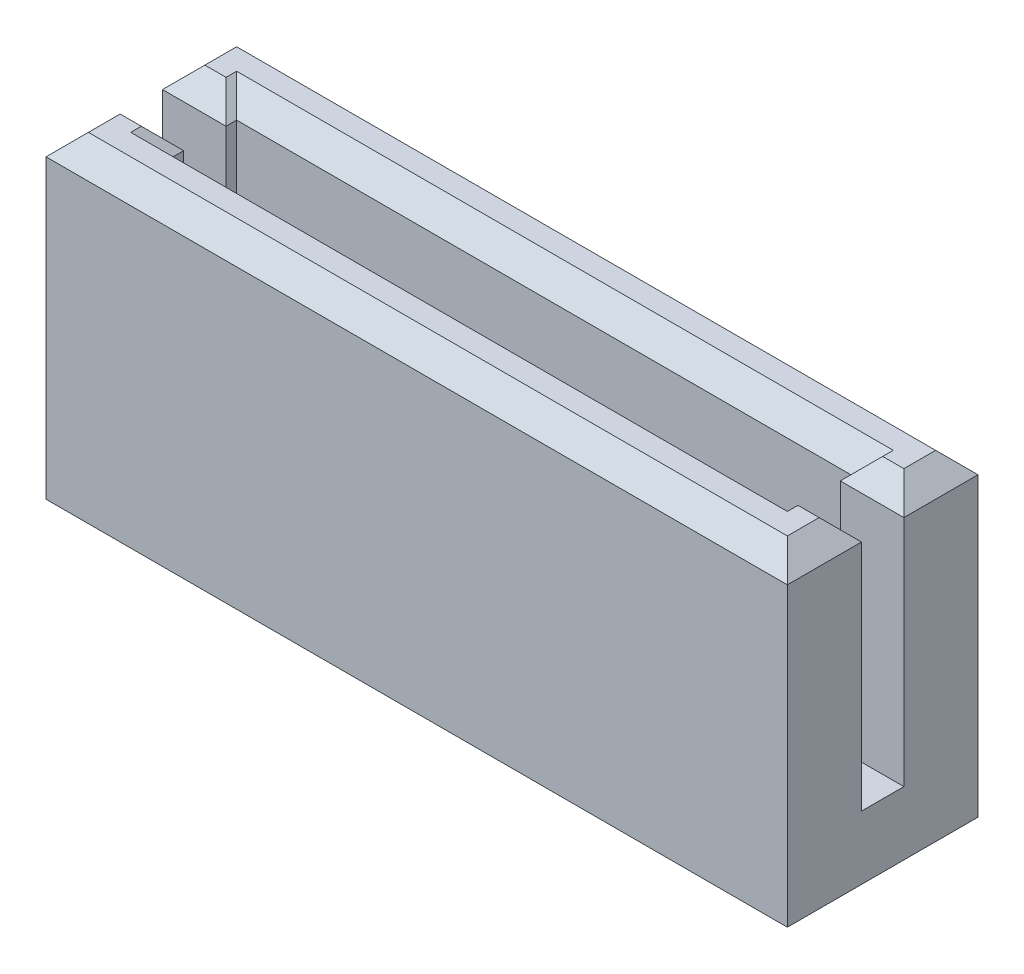
ISO-10303-21;
HEADER;
FILE_DESCRIPTION(('STEP AP214'),'2;1');
FILE_NAME('part.step','',(''),(''),'','','');
FILE_SCHEMA(('AUTOMOTIVE_DESIGN { 1 0 10303 214 1 1 1 1 }'));
ENDSEC;
DATA;
#1=APPLICATION_CONTEXT('core data for automotive mechanical design processes');
#2=APPLICATION_PROTOCOL_DEFINITION('international standard','automotive_design',2000,#1);
#3=PRODUCT_CONTEXT('',#1,'mechanical');
#4=PRODUCT('Part','Part','',(#3));
#5=PRODUCT_RELATED_PRODUCT_CATEGORY('part','',(#4));
#6=PRODUCT_DEFINITION_FORMATION('','',#4);
#7=PRODUCT_DEFINITION_CONTEXT('part definition',#1,'design');
#8=PRODUCT_DEFINITION('design','',#6,#7);
#9=PRODUCT_DEFINITION_SHAPE('','',#8);
#10=(LENGTH_UNIT() NAMED_UNIT(*) SI_UNIT(.MILLI.,.METRE.));
#11=(NAMED_UNIT(*) PLANE_ANGLE_UNIT() SI_UNIT($,.RADIAN.));
#12=(NAMED_UNIT(*) SI_UNIT($,.STERADIAN.) SOLID_ANGLE_UNIT());
#13=UNCERTAINTY_MEASURE_WITH_UNIT(LENGTH_MEASURE(1.E-05),#10,'distance_accuracy_value','');
#14=(GEOMETRIC_REPRESENTATION_CONTEXT(3) GLOBAL_UNCERTAINTY_ASSIGNED_CONTEXT((#13)) GLOBAL_UNIT_ASSIGNED_CONTEXT((#10,
#11,#12)) REPRESENTATION_CONTEXT('',''));
#15=CARTESIAN_POINT('',(0.,0.,0.));
#16=DIRECTION('',(0.,0.,1.));
#17=DIRECTION('',(1.,0.,0.));
#18=AXIS2_PLACEMENT_3D('',#15,#16,#17);
#19=CARTESIAN_POINT('',(0.,3.,0.));
#20=DIRECTION('',(0.,-1.,0.));
#21=DIRECTION('',(0.,0.,-1.));
#22=AXIS2_PLACEMENT_3D('',#19,#20,#21);
#23=PLANE('',#22);
#24=DIRECTION('',(-1.,0.,0.));
#25=VECTOR('',#24,1.);
#26=CARTESIAN_POINT('',(35.,3.,-3.5));
#27=LINE('',#26,#25);
#28=CARTESIAN_POINT('',(35.,3.,-3.5));
#29=VERTEX_POINT('',#28);
#30=CARTESIAN_POINT('',(32.,3.,-3.5));
#31=VERTEX_POINT('',#30);
#32=EDGE_CURVE('E207',#29,#31,#27,.T.);
#33=ORIENTED_EDGE('',*,*,#32,.F.);
#34=DIRECTION('',(0.,0.,-1.));
#35=VECTOR('',#34,1.);
#36=CARTESIAN_POINT('',(35.,3.,0.));
#37=LINE('',#36,#35);
#38=CARTESIAN_POINT('',(35.,3.,-5.5));
#39=VERTEX_POINT('',#38);
#40=EDGE_CURVE('E215',#29,#39,#37,.T.);
#41=ORIENTED_EDGE('',*,*,#40,.T.);
#42=DIRECTION('',(1.,0.,0.));
#43=VECTOR('',#42,1.);
#44=CARTESIAN_POINT('',(35.,3.,-5.5));
#45=LINE('',#44,#43);
#46=CARTESIAN_POINT('',(32.,3.,-5.5));
#47=VERTEX_POINT('',#46);
#48=EDGE_CURVE('E247',#47,#39,#45,.T.);
#49=ORIENTED_EDGE('',*,*,#48,.F.);
#50=DIRECTION('',(0.,0.,1.));
#51=VECTOR('',#50,1.);
#52=CARTESIAN_POINT('',(32.,3.,-6.));
#53=LINE('',#52,#51);
#54=CARTESIAN_POINT('',(32.,3.,-6.));
#55=VERTEX_POINT('',#54);
#56=EDGE_CURVE('E244',#55,#47,#53,.T.);
#57=ORIENTED_EDGE('',*,*,#56,.F.);
#58=DIRECTION('',(1.,0.,0.));
#59=VECTOR('',#58,1.);
#60=CARTESIAN_POINT('',(3.,3.,-6.));
#61=LINE('',#60,#59);
#62=CARTESIAN_POINT('',(3.,3.,-6.));
#63=VERTEX_POINT('',#62);
#64=EDGE_CURVE('E241',#63,#55,#61,.T.);
#65=ORIENTED_EDGE('',*,*,#64,.F.);
#66=DIRECTION('',(0.,0.,-1.));
#67=VECTOR('',#66,1.);
#68=CARTESIAN_POINT('',(3.,3.,-6.));
#69=LINE('',#68,#67);
#70=CARTESIAN_POINT('',(3.,3.,-5.5));
#71=VERTEX_POINT('',#70);
#72=EDGE_CURVE('E233',#71,#63,#69,.T.);
#73=ORIENTED_EDGE('',*,*,#72,.F.);
#74=DIRECTION('',(1.,0.,0.));
#75=VECTOR('',#74,1.);
#76=CARTESIAN_POINT('',(0.,3.,-5.5));
#77=LINE('',#76,#75);
#78=CARTESIAN_POINT('',(0.,3.,-5.5));
#79=VERTEX_POINT('',#78);
#80=EDGE_CURVE('E230',#79,#71,#77,.T.);
#81=ORIENTED_EDGE('',*,*,#80,.F.);
#82=DIRECTION('',(0.,0.,1.));
#83=VECTOR('',#82,1.);
#84=CARTESIAN_POINT('',(0.,3.,0.));
#85=LINE('',#84,#83);
#86=CARTESIAN_POINT('',(0.,3.,-3.5));
#87=VERTEX_POINT('',#86);
#88=EDGE_CURVE('E224',#79,#87,#85,.T.);
#89=ORIENTED_EDGE('',*,*,#88,.T.);
#90=DIRECTION('',(-1.,0.,0.));
#91=VECTOR('',#90,1.);
#92=CARTESIAN_POINT('',(0.,3.,-3.5));
#93=LINE('',#92,#91);
#94=CARTESIAN_POINT('',(3.,3.,-3.5));
#95=VERTEX_POINT('',#94);
#96=EDGE_CURVE('E915',#95,#87,#93,.T.);
#97=ORIENTED_EDGE('',*,*,#96,.F.);
#98=DIRECTION('',(0.,0.,-1.));
#99=VECTOR('',#98,1.);
#100=CARTESIAN_POINT('',(3.,3.,-3.));
#101=LINE('',#100,#99);
#102=CARTESIAN_POINT('',(3.,3.,-3.));
#103=VERTEX_POINT('',#102);
#104=EDGE_CURVE('E918',#103,#95,#101,.T.);
#105=ORIENTED_EDGE('',*,*,#104,.F.);
#106=DIRECTION('',(-1.,0.,0.));
#107=VECTOR('',#106,1.);
#108=CARTESIAN_POINT('',(3.,3.,-3.));
#109=LINE('',#108,#107);
#110=CARTESIAN_POINT('',(32.,3.,-3.));
#111=VERTEX_POINT('',#110);
#112=EDGE_CURVE('E235',#111,#103,#109,.T.);
#113=ORIENTED_EDGE('',*,*,#112,.F.);
#114=DIRECTION('',(0.,0.,1.));
#115=VECTOR('',#114,1.);
#116=CARTESIAN_POINT('',(32.,3.,-3.));
#117=LINE('',#116,#115);
#118=EDGE_CURVE('E229',#31,#111,#117,.T.);
#119=ORIENTED_EDGE('',*,*,#118,.F.);
#120=EDGE_LOOP('',(#33,#41,#49,#57,#65,#73,#81,#89,#97,#105,#113,#119));
#121=FACE_BOUND('',#120,.T.);
#122=ADVANCED_FACE('F39',(#121),#23,.F.);
#123=CARTESIAN_POINT('',(0.,3.,0.));
#124=DIRECTION('',(1.,0.,0.));
#125=DIRECTION('',(0.,0.,-1.));
#126=AXIS2_PLACEMENT_3D('',#123,#124,#125);
#127=PLANE('',#126);
#128=DIRECTION('',(0.,-1.,0.));
#129=VECTOR('',#128,1.);
#130=CARTESIAN_POINT('',(0.,15.,-5.5));
#131=LINE('',#130,#129);
#132=CARTESIAN_POINT('',(0.,14.,-5.5));
#133=VERTEX_POINT('',#132);
#134=EDGE_CURVE('E258',#133,#79,#131,.T.);
#135=ORIENTED_EDGE('',*,*,#134,.F.);
#136=DIRECTION('',(0.,0.,-1.));
#137=VECTOR('',#136,1.);
#138=CARTESIAN_POINT('',(0.,14.,-9.));
#139=LINE('',#138,#137);
#140=CARTESIAN_POINT('',(0.,14.,-9.));
#141=VERTEX_POINT('',#140);
#142=EDGE_CURVE('E317',#133,#141,#139,.T.);
#143=ORIENTED_EDGE('',*,*,#142,.T.);
#144=DIRECTION('',(0.,-1.,0.));
#145=VECTOR('',#144,1.);
#146=CARTESIAN_POINT('',(0.,3.,-9.));
#147=LINE('',#146,#145);
#148=CARTESIAN_POINT('',(0.,0.,-9.));
#149=VERTEX_POINT('',#148);
#150=EDGE_CURVE('E223',#141,#149,#147,.T.);
#151=ORIENTED_EDGE('',*,*,#150,.T.);
#152=DIRECTION('',(0.,0.,1.));
#153=VECTOR('',#152,1.);
#154=CARTESIAN_POINT('',(0.,0.,0.));
#155=LINE('',#154,#153);
#156=CARTESIAN_POINT('',(0.,0.,0.));
#157=VERTEX_POINT('',#156);
#158=EDGE_CURVE('E260',#149,#157,#155,.T.);
#159=ORIENTED_EDGE('',*,*,#158,.T.);
#160=DIRECTION('',(0.,-1.,0.));
#161=VECTOR('',#160,1.);
#162=CARTESIAN_POINT('',(0.,3.,0.));
#163=LINE('',#162,#161);
#164=CARTESIAN_POINT('',(0.,14.,0.));
#165=VERTEX_POINT('',#164);
#166=EDGE_CURVE('E279',#165,#157,#163,.T.);
#167=ORIENTED_EDGE('',*,*,#166,.F.);
#168=DIRECTION('',(0.,0.,-1.));
#169=VECTOR('',#168,1.);
#170=CARTESIAN_POINT('',(0.,14.,0.));
#171=LINE('',#170,#169);
#172=CARTESIAN_POINT('',(0.,14.,-3.5));
#173=VERTEX_POINT('',#172);
#174=EDGE_CURVE('E315',#165,#173,#171,.T.);
#175=ORIENTED_EDGE('',*,*,#174,.T.);
#176=DIRECTION('',(0.,-1.,0.));
#177=VECTOR('',#176,1.);
#178=CARTESIAN_POINT('',(0.,15.,-3.5));
#179=LINE('',#178,#177);
#180=EDGE_CURVE('E913',#173,#87,#179,.T.);
#181=ORIENTED_EDGE('',*,*,#180,.T.);
#182=ORIENTED_EDGE('',*,*,#88,.F.);
#183=EDGE_LOOP('',(#135,#143,#151,#159,#167,#175,#181,#182));
#184=FACE_BOUND('',#183,.T.);
#185=ADVANCED_FACE('F467',(#184),#127,.F.);
#186=CARTESIAN_POINT('',(0.,3.,0.));
#187=DIRECTION('',(0.,0.,-1.));
#188=DIRECTION('',(-1.,0.,0.));
#189=AXIS2_PLACEMENT_3D('',#186,#187,#188);
#190=PLANE('',#189);
#191=DIRECTION('',(0.,-1.,0.));
#192=VECTOR('',#191,1.);
#193=CARTESIAN_POINT('',(35.,3.,0.));
#194=LINE('',#193,#192);
#195=CARTESIAN_POINT('',(35.,14.,0.));
#196=VERTEX_POINT('',#195);
#197=CARTESIAN_POINT('',(35.,0.,0.));
#198=VERTEX_POINT('',#197);
#199=EDGE_CURVE('E277',#196,#198,#194,.T.);
#200=ORIENTED_EDGE('',*,*,#199,.F.);
#201=DIRECTION('',(-1.,0.,0.));
#202=VECTOR('',#201,1.);
#203=CARTESIAN_POINT('',(0.,14.,0.));
#204=LINE('',#203,#202);
#205=EDGE_CURVE('E11',#196,#165,#204,.T.);
#206=ORIENTED_EDGE('',*,*,#205,.T.);
#207=ORIENTED_EDGE('',*,*,#166,.T.);
#208=DIRECTION('',(1.,0.,0.));
#209=VECTOR('',#208,1.);
#210=CARTESIAN_POINT('',(0.,0.,0.));
#211=LINE('',#210,#209);
#212=EDGE_CURVE('E266',#157,#198,#211,.T.);
#213=ORIENTED_EDGE('',*,*,#212,.T.);
#214=EDGE_LOOP('',(#200,#206,#207,#213));
#215=FACE_BOUND('',#214,.T.);
#216=ADVANCED_FACE('F398',(#215),#190,.F.);
#217=CARTESIAN_POINT('',(35.,3.,0.));
#218=DIRECTION('',(-1.,0.,0.));
#219=DIRECTION('',(0.,0.,1.));
#220=AXIS2_PLACEMENT_3D('',#217,#218,#219);
#221=PLANE('',#220);
#222=DIRECTION('',(0.,-1.,0.));
#223=VECTOR('',#222,1.);
#224=CARTESIAN_POINT('',(35.,3.,-9.));
#225=LINE('',#224,#223);
#226=CARTESIAN_POINT('',(35.,14.,-9.));
#227=VERTEX_POINT('',#226);
#228=CARTESIAN_POINT('',(35.,0.,-9.));
#229=VERTEX_POINT('',#228);
#230=EDGE_CURVE('E275',#227,#229,#225,.T.);
#231=ORIENTED_EDGE('',*,*,#230,.F.);
#232=DIRECTION('',(0.,0.,1.));
#233=VECTOR('',#232,1.);
#234=CARTESIAN_POINT('',(35.,14.,-5.5));
#235=LINE('',#234,#233);
#236=CARTESIAN_POINT('',(35.,14.,-5.5));
#237=VERTEX_POINT('',#236);
#238=EDGE_CURVE('E303',#227,#237,#235,.T.);
#239=ORIENTED_EDGE('',*,*,#238,.T.);
#240=DIRECTION('',(0.,-1.,0.));
#241=VECTOR('',#240,1.);
#242=CARTESIAN_POINT('',(35.,15.,-5.5));
#243=LINE('',#242,#241);
#244=EDGE_CURVE('E219',#237,#39,#243,.T.);
#245=ORIENTED_EDGE('',*,*,#244,.T.);
#246=ORIENTED_EDGE('',*,*,#40,.F.);
#247=DIRECTION('',(0.,-1.,0.));
#248=VECTOR('',#247,1.);
#249=CARTESIAN_POINT('',(35.,15.,-3.5));
#250=LINE('',#249,#248);
#251=CARTESIAN_POINT('',(35.,14.,-3.5));
#252=VERTEX_POINT('',#251);
#253=EDGE_CURVE('E203',#252,#29,#250,.T.);
#254=ORIENTED_EDGE('',*,*,#253,.F.);
#255=DIRECTION('',(0.,0.,1.));
#256=VECTOR('',#255,1.);
#257=CARTESIAN_POINT('',(35.,14.,0.));
#258=LINE('',#257,#256);
#259=EDGE_CURVE('E301',#252,#196,#258,.T.);
#260=ORIENTED_EDGE('',*,*,#259,.T.);
#261=ORIENTED_EDGE('',*,*,#199,.T.);
#262=DIRECTION('',(0.,0.,-1.));
#263=VECTOR('',#262,1.);
#264=CARTESIAN_POINT('',(35.,0.,0.));
#265=LINE('',#264,#263);
#266=EDGE_CURVE('E269',#198,#229,#265,.T.);
#267=ORIENTED_EDGE('',*,*,#266,.T.);
#268=EDGE_LOOP('',(#231,#239,#245,#246,#254,#260,#261,#267));
#269=FACE_BOUND('',#268,.T.);
#270=ADVANCED_FACE('F217',(#269),#221,.F.);
#271=CARTESIAN_POINT('',(0.,3.,-9.));
#272=DIRECTION('',(0.,0.,1.));
#273=DIRECTION('',(1.,0.,0.));
#274=AXIS2_PLACEMENT_3D('',#271,#272,#273);
#275=PLANE('',#274);
#276=ORIENTED_EDGE('',*,*,#150,.F.);
#277=DIRECTION('',(1.,0.,0.));
#278=VECTOR('',#277,1.);
#279=CARTESIAN_POINT('',(35.,14.,-9.));
#280=LINE('',#279,#278);
#281=EDGE_CURVE('E298',#141,#227,#280,.T.);
#282=ORIENTED_EDGE('',*,*,#281,.T.);
#283=ORIENTED_EDGE('',*,*,#230,.T.);
#284=DIRECTION('',(-1.,0.,0.));
#285=VECTOR('',#284,1.);
#286=CARTESIAN_POINT('',(0.,0.,-9.));
#287=LINE('',#286,#285);
#288=EDGE_CURVE('E262',#229,#149,#287,.T.);
#289=ORIENTED_EDGE('',*,*,#288,.T.);
#290=EDGE_LOOP('',(#276,#282,#283,#289));
#291=FACE_BOUND('',#290,.T.);
#292=ADVANCED_FACE('F409',(#291),#275,.F.);
#293=CARTESIAN_POINT('',(0.,0.,0.));
#294=DIRECTION('',(0.,-1.,0.));
#295=DIRECTION('',(0.,0.,-1.));
#296=AXIS2_PLACEMENT_3D('',#293,#294,#295);
#297=PLANE('',#296);
#298=ORIENTED_EDGE('',*,*,#158,.F.);
#299=ORIENTED_EDGE('',*,*,#288,.F.);
#300=ORIENTED_EDGE('',*,*,#266,.F.);
#301=ORIENTED_EDGE('',*,*,#212,.F.);
#302=EDGE_LOOP('',(#298,#299,#300,#301));
#303=FACE_BOUND('',#302,.T.);
#304=ADVANCED_FACE('F405',(#303),#297,.T.);
#305=CARTESIAN_POINT('',(0.,15.,-5.5));
#306=DIRECTION('',(0.,0.,-1.));
#307=DIRECTION('',(-1.,0.,0.));
#308=AXIS2_PLACEMENT_3D('',#305,#306,#307);
#309=PLANE('',#308);
#310=DIRECTION('',(0.,-1.,0.));
#311=VECTOR('',#310,1.);
#312=CARTESIAN_POINT('',(3.,15.,-5.5));
#313=LINE('',#312,#311);
#314=CARTESIAN_POINT('',(3.,14.,-5.5));
#315=VERTEX_POINT('',#314);
#316=EDGE_CURVE('E256',#315,#71,#313,.T.);
#317=ORIENTED_EDGE('',*,*,#316,.F.);
#318=DIRECTION('',(-1.,0.,0.));
#319=VECTOR('',#318,1.);
#320=CARTESIAN_POINT('',(0.,14.,-5.5));
#321=LINE('',#320,#319);
#322=EDGE_CURVE('E313',#315,#133,#321,.T.);
#323=ORIENTED_EDGE('',*,*,#322,.T.);
#324=ORIENTED_EDGE('',*,*,#134,.T.);
#325=ORIENTED_EDGE('',*,*,#80,.T.);
#326=EDGE_LOOP('',(#317,#323,#324,#325));
#327=FACE_BOUND('',#326,.T.);
#328=ADVANCED_FACE('F462',(#327),#309,.F.);
#329=CARTESIAN_POINT('',(3.,15.,-6.));
#330=DIRECTION('',(-1.,0.,0.));
#331=DIRECTION('',(0.,0.,1.));
#332=AXIS2_PLACEMENT_3D('',#329,#330,#331);
#333=PLANE('',#332);
#334=DIRECTION('',(0.,-1.,0.));
#335=VECTOR('',#334,1.);
#336=CARTESIAN_POINT('',(3.,15.,-6.));
#337=LINE('',#336,#335);
#338=CARTESIAN_POINT('',(3.,14.,-6.));
#339=VERTEX_POINT('',#338);
#340=EDGE_CURVE('E254',#339,#63,#337,.T.);
#341=ORIENTED_EDGE('',*,*,#340,.F.);
#342=DIRECTION('',(0.,0.,1.));
#343=VECTOR('',#342,1.);
#344=CARTESIAN_POINT('',(3.,14.,-5.5));
#345=LINE('',#344,#343);
#346=EDGE_CURVE('E311',#339,#315,#345,.T.);
#347=ORIENTED_EDGE('',*,*,#346,.T.);
#348=ORIENTED_EDGE('',*,*,#316,.T.);
#349=ORIENTED_EDGE('',*,*,#72,.T.);
#350=EDGE_LOOP('',(#341,#347,#348,#349));
#351=FACE_BOUND('',#350,.T.);
#352=ADVANCED_FACE('F456',(#351),#333,.F.);
#353=CARTESIAN_POINT('',(3.,15.,-6.));
#354=DIRECTION('',(0.,0.,-1.));
#355=DIRECTION('',(-1.,0.,0.));
#356=AXIS2_PLACEMENT_3D('',#353,#354,#355);
#357=PLANE('',#356);
#358=DIRECTION('',(0.,-1.,0.));
#359=VECTOR('',#358,1.);
#360=CARTESIAN_POINT('',(32.,15.,-6.));
#361=LINE('',#360,#359);
#362=CARTESIAN_POINT('',(32.,14.,-6.));
#363=VERTEX_POINT('',#362);
#364=EDGE_CURVE('E252',#363,#55,#361,.T.);
#365=ORIENTED_EDGE('',*,*,#364,.F.);
#366=DIRECTION('',(-1.,0.,0.));
#367=VECTOR('',#366,1.);
#368=CARTESIAN_POINT('',(3.,14.,-6.));
#369=LINE('',#368,#367);
#370=EDGE_CURVE('E309',#363,#339,#369,.T.);
#371=ORIENTED_EDGE('',*,*,#370,.T.);
#372=ORIENTED_EDGE('',*,*,#340,.T.);
#373=ORIENTED_EDGE('',*,*,#64,.T.);
#374=EDGE_LOOP('',(#365,#371,#372,#373));
#375=FACE_BOUND('',#374,.T.);
#376=ADVANCED_FACE('F453',(#375),#357,.F.);
#377=CARTESIAN_POINT('',(32.,15.,-6.));
#378=DIRECTION('',(1.,0.,0.));
#379=DIRECTION('',(0.,0.,-1.));
#380=AXIS2_PLACEMENT_3D('',#377,#378,#379);
#381=PLANE('',#380);
#382=DIRECTION('',(0.,-1.,0.));
#383=VECTOR('',#382,1.);
#384=CARTESIAN_POINT('',(32.,15.,-5.5));
#385=LINE('',#384,#383);
#386=CARTESIAN_POINT('',(32.,14.,-5.5));
#387=VERTEX_POINT('',#386);
#388=EDGE_CURVE('E250',#387,#47,#385,.T.);
#389=ORIENTED_EDGE('',*,*,#388,.F.);
#390=DIRECTION('',(0.,0.,-1.));
#391=VECTOR('',#390,1.);
#392=CARTESIAN_POINT('',(32.,14.,-6.));
#393=LINE('',#392,#391);
#394=EDGE_CURVE('E307',#387,#363,#393,.T.);
#395=ORIENTED_EDGE('',*,*,#394,.T.);
#396=ORIENTED_EDGE('',*,*,#364,.T.);
#397=ORIENTED_EDGE('',*,*,#56,.T.);
#398=EDGE_LOOP('',(#389,#395,#396,#397));
#399=FACE_BOUND('',#398,.T.);
#400=ADVANCED_FACE('F438',(#399),#381,.F.);
#401=CARTESIAN_POINT('',(35.,15.,-5.5));
#402=DIRECTION('',(0.,0.,-1.));
#403=DIRECTION('',(-1.,0.,0.));
#404=AXIS2_PLACEMENT_3D('',#401,#402,#403);
#405=PLANE('',#404);
#406=ORIENTED_EDGE('',*,*,#244,.F.);
#407=DIRECTION('',(-1.,0.,0.));
#408=VECTOR('',#407,1.);
#409=CARTESIAN_POINT('',(32.,14.,-5.5));
#410=LINE('',#409,#408);
#411=EDGE_CURVE('E305',#237,#387,#410,.T.);
#412=ORIENTED_EDGE('',*,*,#411,.T.);
#413=ORIENTED_EDGE('',*,*,#388,.T.);
#414=ORIENTED_EDGE('',*,*,#48,.T.);
#415=EDGE_LOOP('',(#406,#412,#413,#414));
#416=FACE_BOUND('',#415,.T.);
#417=ADVANCED_FACE('F435',(#416),#405,.F.);
#418=CARTESIAN_POINT('',(0.,15.,0.));
#419=DIRECTION('',(0.,1.,0.));
#420=DIRECTION('',(0.,0.,1.));
#421=AXIS2_PLACEMENT_3D('',#418,#419,#420);
#422=PLANE('',#421);
#423=DIRECTION('',(0.,0.,-1.));
#424=VECTOR('',#423,1.);
#425=CARTESIAN_POINT('',(34.,15.,-9.));
#426=LINE('',#425,#424);
#427=CARTESIAN_POINT('',(34.,15.,-6.50000000000001));
#428=VERTEX_POINT('',#427);
#429=CARTESIAN_POINT('',(34.,15.,-8.));
#430=VERTEX_POINT('',#429);
#431=EDGE_CURVE('E293',#428,#430,#426,.T.);
#432=ORIENTED_EDGE('',*,*,#431,.T.);
#433=DIRECTION('',(-1.,0.,0.));
#434=VECTOR('',#433,1.);
#435=CARTESIAN_POINT('',(0.,15.,-8.));
#436=LINE('',#435,#434);
#437=CARTESIAN_POINT('',(1.,15.,-8.));
#438=VERTEX_POINT('',#437);
#439=EDGE_CURVE('E295',#430,#438,#436,.T.);
#440=ORIENTED_EDGE('',*,*,#439,.T.);
#441=DIRECTION('',(0.,0.,1.));
#442=VECTOR('',#441,1.);
#443=CARTESIAN_POINT('',(1.,15.,-5.5));
#444=LINE('',#443,#442);
#445=CARTESIAN_POINT('',(1.,15.,-6.50000000000001));
#446=VERTEX_POINT('',#445);
#447=EDGE_CURVE('E281',#438,#446,#444,.T.);
#448=ORIENTED_EDGE('',*,*,#447,.T.);
#449=DIRECTION('',(1.,0.,0.));
#450=VECTOR('',#449,1.);
#451=CARTESIAN_POINT('',(3.,15.,-6.50000000000001));
#452=LINE('',#451,#450);
#453=CARTESIAN_POINT('',(2.,15.,-6.50000000000001));
#454=VERTEX_POINT('',#453);
#455=EDGE_CURVE('E283',#446,#454,#452,.T.);
#456=ORIENTED_EDGE('',*,*,#455,.T.);
#457=DIRECTION('',(0.,0.,-1.));
#458=VECTOR('',#457,1.);
#459=CARTESIAN_POINT('',(2.,15.,-6.));
#460=LINE('',#459,#458);
#461=CARTESIAN_POINT('',(2.,15.,-7.));
#462=VERTEX_POINT('',#461);
#463=EDGE_CURVE('E285',#454,#462,#460,.T.);
#464=ORIENTED_EDGE('',*,*,#463,.T.);
#465=DIRECTION('',(1.,0.,0.));
#466=VECTOR('',#465,1.);
#467=CARTESIAN_POINT('',(32.,15.,-7.));
#468=LINE('',#467,#466);
#469=CARTESIAN_POINT('',(33.,15.,-7.));
#470=VERTEX_POINT('',#469);
#471=EDGE_CURVE('E287',#462,#470,#468,.T.);
#472=ORIENTED_EDGE('',*,*,#471,.T.);
#473=DIRECTION('',(0.,0.,1.));
#474=VECTOR('',#473,1.);
#475=CARTESIAN_POINT('',(33.,15.,-5.5));
#476=LINE('',#475,#474);
#477=CARTESIAN_POINT('',(33.,15.,-6.50000000000001));
#478=VERTEX_POINT('',#477);
#479=EDGE_CURVE('E289',#470,#478,#476,.T.);
#480=ORIENTED_EDGE('',*,*,#479,.T.);
#481=DIRECTION('',(1.,0.,0.));
#482=VECTOR('',#481,1.);
#483=CARTESIAN_POINT('',(35.,15.,-6.50000000000001));
#484=LINE('',#483,#482);
#485=EDGE_CURVE('E291',#478,#428,#484,.T.);
#486=ORIENTED_EDGE('',*,*,#485,.T.);
#487=EDGE_LOOP('',(#432,#440,#448,#456,#464,#472,#480,#486));
#488=FACE_BOUND('',#487,.T.);
#489=ADVANCED_FACE('F423',(#488),#422,.T.);
#490=CARTESIAN_POINT('',(35.,15.,-3.5));
#491=DIRECTION('',(0.,0.,1.));
#492=DIRECTION('',(1.,0.,0.));
#493=AXIS2_PLACEMENT_3D('',#490,#491,#492);
#494=PLANE('',#493);
#495=DIRECTION('',(0.,-1.,0.));
#496=VECTOR('',#495,1.);
#497=CARTESIAN_POINT('',(32.,15.,-3.5));
#498=LINE('',#497,#496);
#499=CARTESIAN_POINT('',(32.,14.,-3.5));
#500=VERTEX_POINT('',#499);
#501=EDGE_CURVE('E211',#500,#31,#498,.T.);
#502=ORIENTED_EDGE('',*,*,#501,.F.);
#503=DIRECTION('',(1.,0.,0.));
#504=VECTOR('',#503,1.);
#505=CARTESIAN_POINT('',(35.,14.,-3.5));
#506=LINE('',#505,#504);
#507=EDGE_CURVE('E49',#500,#252,#506,.T.);
#508=ORIENTED_EDGE('',*,*,#507,.T.);
#509=ORIENTED_EDGE('',*,*,#253,.T.);
#510=ORIENTED_EDGE('',*,*,#32,.T.);
#511=EDGE_LOOP('',(#502,#508,#509,#510));
#512=FACE_BOUND('',#511,.T.);
#513=ADVANCED_FACE('F205',(#512),#494,.F.);
#514=CARTESIAN_POINT('',(32.,15.,-3.));
#515=DIRECTION('',(1.,0.,0.));
#516=DIRECTION('',(0.,0.,-1.));
#517=AXIS2_PLACEMENT_3D('',#514,#515,#516);
#518=PLANE('',#517);
#519=DIRECTION('',(0.,-1.,0.));
#520=VECTOR('',#519,1.);
#521=CARTESIAN_POINT('',(32.,15.,-3.));
#522=LINE('',#521,#520);
#523=CARTESIAN_POINT('',(32.,14.,-3.));
#524=VERTEX_POINT('',#523);
#525=EDGE_CURVE('E904',#524,#111,#522,.T.);
#526=ORIENTED_EDGE('',*,*,#525,.F.);
#527=DIRECTION('',(0.,0.,-1.));
#528=VECTOR('',#527,1.);
#529=CARTESIAN_POINT('',(32.,14.,-3.));
#530=LINE('',#529,#528);
#531=EDGE_CURVE('E57',#524,#500,#530,.T.);
#532=ORIENTED_EDGE('',*,*,#531,.T.);
#533=ORIENTED_EDGE('',*,*,#501,.T.);
#534=ORIENTED_EDGE('',*,*,#118,.T.);
#535=EDGE_LOOP('',(#526,#532,#533,#534));
#536=FACE_BOUND('',#535,.T.);
#537=ADVANCED_FACE('F663',(#536),#518,.F.);
#538=CARTESIAN_POINT('',(3.,15.,-3.));
#539=DIRECTION('',(0.,0.,1.));
#540=DIRECTION('',(1.,0.,0.));
#541=AXIS2_PLACEMENT_3D('',#538,#539,#540);
#542=PLANE('',#541);
#543=DIRECTION('',(0.,-1.,0.));
#544=VECTOR('',#543,1.);
#545=CARTESIAN_POINT('',(3.,15.,-3.));
#546=LINE('',#545,#544);
#547=CARTESIAN_POINT('',(3.,14.,-3.));
#548=VERTEX_POINT('',#547);
#549=EDGE_CURVE('E906',#548,#103,#546,.T.);
#550=ORIENTED_EDGE('',*,*,#549,.F.);
#551=DIRECTION('',(1.,0.,0.));
#552=VECTOR('',#551,1.);
#553=CARTESIAN_POINT('',(3.,14.,-3.));
#554=LINE('',#553,#552);
#555=EDGE_CURVE('E65',#548,#524,#554,.T.);
#556=ORIENTED_EDGE('',*,*,#555,.T.);
#557=ORIENTED_EDGE('',*,*,#525,.T.);
#558=ORIENTED_EDGE('',*,*,#112,.T.);
#559=EDGE_LOOP('',(#550,#556,#557,#558));
#560=FACE_BOUND('',#559,.T.);
#561=ADVANCED_FACE('F652',(#560),#542,.F.);
#562=CARTESIAN_POINT('',(3.,15.,-3.));
#563=DIRECTION('',(-1.,0.,0.));
#564=DIRECTION('',(0.,0.,1.));
#565=AXIS2_PLACEMENT_3D('',#562,#563,#564);
#566=PLANE('',#565);
#567=DIRECTION('',(0.,-1.,0.));
#568=VECTOR('',#567,1.);
#569=CARTESIAN_POINT('',(3.,15.,-3.5));
#570=LINE('',#569,#568);
#571=CARTESIAN_POINT('',(3.,14.,-3.5));
#572=VERTEX_POINT('',#571);
#573=EDGE_CURVE('E908',#572,#95,#570,.T.);
#574=ORIENTED_EDGE('',*,*,#573,.F.);
#575=DIRECTION('',(0.,0.,1.));
#576=VECTOR('',#575,1.);
#577=CARTESIAN_POINT('',(3.,14.,-3.));
#578=LINE('',#577,#576);
#579=EDGE_CURVE('E339',#572,#548,#578,.T.);
#580=ORIENTED_EDGE('',*,*,#579,.T.);
#581=ORIENTED_EDGE('',*,*,#549,.T.);
#582=ORIENTED_EDGE('',*,*,#104,.T.);
#583=EDGE_LOOP('',(#574,#580,#581,#582));
#584=FACE_BOUND('',#583,.T.);
#585=ADVANCED_FACE('F641',(#584),#566,.F.);
#586=CARTESIAN_POINT('',(0.,15.,-3.5));
#587=DIRECTION('',(0.,0.,1.));
#588=DIRECTION('',(1.,0.,0.));
#589=AXIS2_PLACEMENT_3D('',#586,#587,#588);
#590=PLANE('',#589);
#591=ORIENTED_EDGE('',*,*,#180,.F.);
#592=DIRECTION('',(1.,0.,0.));
#593=VECTOR('',#592,1.);
#594=CARTESIAN_POINT('',(0.,14.,-3.5));
#595=LINE('',#594,#593);
#596=EDGE_CURVE('E336',#173,#572,#595,.T.);
#597=ORIENTED_EDGE('',*,*,#596,.T.);
#598=ORIENTED_EDGE('',*,*,#573,.T.);
#599=ORIENTED_EDGE('',*,*,#96,.T.);
#600=EDGE_LOOP('',(#591,#597,#598,#599));
#601=FACE_BOUND('',#600,.T.);
#602=ADVANCED_FACE('F630',(#601),#590,.F.);
#603=CARTESIAN_POINT('',(0.,15.,0.));
#604=DIRECTION('',(0.,-1.,0.));
#605=DIRECTION('',(0.,0.,-1.));
#606=AXIS2_PLACEMENT_3D('',#603,#604,#605);
#607=PLANE('',#606);
#608=DIRECTION('',(0.,0.,-1.));
#609=VECTOR('',#608,1.);
#610=CARTESIAN_POINT('',(2.,15.,0.));
#611=LINE('',#610,#609);
#612=CARTESIAN_POINT('',(2.,15.,-2.));
#613=VERTEX_POINT('',#612);
#614=CARTESIAN_POINT('',(2.,15.,-2.5));
#615=VERTEX_POINT('',#614);
#616=EDGE_CURVE('E331',#613,#615,#611,.T.);
#617=ORIENTED_EDGE('',*,*,#616,.T.);
#618=DIRECTION('',(-1.,0.,0.));
#619=VECTOR('',#618,1.);
#620=CARTESIAN_POINT('',(0.,15.,-2.5));
#621=LINE('',#620,#619);
#622=CARTESIAN_POINT('',(1.,15.,-2.5));
#623=VERTEX_POINT('',#622);
#624=EDGE_CURVE('E333',#615,#623,#621,.T.);
#625=ORIENTED_EDGE('',*,*,#624,.T.);
#626=DIRECTION('',(0.,0.,1.));
#627=VECTOR('',#626,1.);
#628=CARTESIAN_POINT('',(1.,15.,0.));
#629=LINE('',#628,#627);
#630=CARTESIAN_POINT('',(1.,15.,-1.));
#631=VERTEX_POINT('',#630);
#632=EDGE_CURVE('E319',#623,#631,#629,.T.);
#633=ORIENTED_EDGE('',*,*,#632,.T.);
#634=DIRECTION('',(1.,0.,0.));
#635=VECTOR('',#634,1.);
#636=CARTESIAN_POINT('',(0.,15.,-1.));
#637=LINE('',#636,#635);
#638=CARTESIAN_POINT('',(34.,15.,-1.));
#639=VERTEX_POINT('',#638);
#640=EDGE_CURVE('E321',#631,#639,#637,.T.);
#641=ORIENTED_EDGE('',*,*,#640,.T.);
#642=DIRECTION('',(0.,0.,-1.));
#643=VECTOR('',#642,1.);
#644=CARTESIAN_POINT('',(34.,15.,0.));
#645=LINE('',#644,#643);
#646=CARTESIAN_POINT('',(34.,15.,-2.5));
#647=VERTEX_POINT('',#646);
#648=EDGE_CURVE('E323',#639,#647,#645,.T.);
#649=ORIENTED_EDGE('',*,*,#648,.T.);
#650=DIRECTION('',(-1.,0.,0.));
#651=VECTOR('',#650,1.);
#652=CARTESIAN_POINT('',(0.,15.,-2.49999999999999));
#653=LINE('',#652,#651);
#654=CARTESIAN_POINT('',(33.,15.,-2.5));
#655=VERTEX_POINT('',#654);
#656=EDGE_CURVE('E325',#647,#655,#653,.T.);
#657=ORIENTED_EDGE('',*,*,#656,.T.);
#658=DIRECTION('',(0.,0.,1.));
#659=VECTOR('',#658,1.);
#660=CARTESIAN_POINT('',(33.,15.,0.));
#661=LINE('',#660,#659);
#662=CARTESIAN_POINT('',(33.,15.,-2.));
#663=VERTEX_POINT('',#662);
#664=EDGE_CURVE('E327',#655,#663,#661,.T.);
#665=ORIENTED_EDGE('',*,*,#664,.T.);
#666=DIRECTION('',(-1.,0.,0.));
#667=VECTOR('',#666,1.);
#668=CARTESIAN_POINT('',(0.,15.,-2.));
#669=LINE('',#668,#667);
#670=EDGE_CURVE('E329',#663,#613,#669,.T.);
#671=ORIENTED_EDGE('',*,*,#670,.T.);
#672=EDGE_LOOP('',(#617,#625,#633,#641,#649,#657,#665,#671));
#673=FACE_BOUND('',#672,.T.);
#674=ADVANCED_FACE('F532',(#673),#607,.F.);
#675=CARTESIAN_POINT('',(0.,15.,-7.));
#676=DIRECTION('',(0.,0.707106781186546,0.707106781186549));
#677=DIRECTION('',(-1.,0.,0.));
#678=AXIS2_PLACEMENT_3D('',#675,#676,#677);
#679=PLANE('',#678);
#680=DIRECTION('',(-0.577350269189625,0.577350269189627,-0.577350269189625));
#681=VECTOR('',#680,1.);
#682=CARTESIAN_POINT('',(1.33333333333333,15.6666666666667,-7.66666666666667));
#683=LINE('',#682,#681);
#684=EDGE_CURVE('E360',#339,#462,#683,.T.);
#685=ORIENTED_EDGE('',*,*,#684,.F.);
#686=ORIENTED_EDGE('',*,*,#370,.F.);
#687=DIRECTION('',(0.577350269189624,0.577350269189628,-0.577350269189626));
#688=VECTOR('',#687,1.);
#689=CARTESIAN_POINT('',(30.6666666666667,12.6666666666667,-4.66666666666667));
#690=LINE('',#689,#688);
#691=EDGE_CURVE('E212',#470,#363,#690,.F.);
#692=ORIENTED_EDGE('',*,*,#691,.F.);
#693=ORIENTED_EDGE('',*,*,#471,.F.);
#694=EDGE_LOOP('',(#685,#686,#692,#693));
#695=FACE_BOUND('',#694,.T.);
#696=ADVANCED_FACE('F449',(#695),#679,.T.);
#697=CARTESIAN_POINT('',(33.,15.,0.));
#698=DIRECTION('',(-0.70710678118655,0.707106781186545,0.));
#699=DIRECTION('',(0.,0.,-1.));
#700=AXIS2_PLACEMENT_3D('',#697,#698,#699);
#701=PLANE('',#700);
#702=ORIENTED_EDGE('',*,*,#691,.T.);
#703=ORIENTED_EDGE('',*,*,#394,.F.);
#704=DIRECTION('',(0.577350269189624,0.577350269189628,-0.577350269189626));
#705=VECTOR('',#704,1.);
#706=CARTESIAN_POINT('',(30.8333333333333,12.8333333333333,-4.33333333333334));
#707=LINE('',#706,#705);
#708=EDGE_CURVE('E357',#478,#387,#707,.F.);
#709=ORIENTED_EDGE('',*,*,#708,.F.);
#710=ORIENTED_EDGE('',*,*,#479,.F.);
#711=EDGE_LOOP('',(#702,#703,#709,#710));
#712=FACE_BOUND('',#711,.T.);
#713=ADVANCED_FACE('F442',(#712),#701,.T.);
#714=CARTESIAN_POINT('',(2.,15.,0.));
#715=DIRECTION('',(0.707106781186549,0.707106781186546,0.));
#716=DIRECTION('',(0.,0.,1.));
#717=AXIS2_PLACEMENT_3D('',#714,#715,#716);
#718=PLANE('',#717);
#719=ORIENTED_EDGE('',*,*,#684,.T.);
#720=ORIENTED_EDGE('',*,*,#463,.F.);
#721=DIRECTION('',(-0.577350269189625,0.577350269189627,-0.577350269189625));
#722=VECTOR('',#721,1.);
#723=CARTESIAN_POINT('',(1.33333333333333,15.6666666666667,-7.16666666666667));
#724=LINE('',#723,#722);
#725=EDGE_CURVE('E354',#315,#454,#724,.T.);
#726=ORIENTED_EDGE('',*,*,#725,.F.);
#727=ORIENTED_EDGE('',*,*,#346,.F.);
#728=EDGE_LOOP('',(#719,#720,#726,#727));
#729=FACE_BOUND('',#728,.T.);
#730=ADVANCED_FACE('F472',(#729),#718,.T.);
#731=CARTESIAN_POINT('',(0.,15.,-6.50000000000001));
#732=DIRECTION('',(0.,0.707106781186546,0.707106781186549));
#733=DIRECTION('',(-1.,0.,0.));
#734=AXIS2_PLACEMENT_3D('',#731,#732,#733);
#735=PLANE('',#734);
#736=ORIENTED_EDGE('',*,*,#708,.T.);
#737=ORIENTED_EDGE('',*,*,#411,.F.);
#738=DIRECTION('',(-0.577350269189624,0.577350269189628,-0.577350269189626));
#739=VECTOR('',#738,1.);
#740=CARTESIAN_POINT('',(22.6666666666667,26.3333333333333,-17.8333333333333));
#741=LINE('',#740,#739);
#742=EDGE_CURVE('E351',#428,#237,#741,.F.);
#743=ORIENTED_EDGE('',*,*,#742,.F.);
#744=ORIENTED_EDGE('',*,*,#485,.F.);
#745=EDGE_LOOP('',(#736,#737,#743,#744));
#746=FACE_BOUND('',#745,.T.);
#747=ADVANCED_FACE('F431',(#746),#735,.T.);
#748=CARTESIAN_POINT('',(0.,15.,-6.50000000000001));
#749=DIRECTION('',(0.,0.707106781186546,0.707106781186549));
#750=DIRECTION('',(-1.,0.,0.));
#751=AXIS2_PLACEMENT_3D('',#748,#749,#750);
#752=PLANE('',#751);
#753=ORIENTED_EDGE('',*,*,#725,.T.);
#754=ORIENTED_EDGE('',*,*,#455,.F.);
#755=DIRECTION('',(0.577350269189625,0.577350269189627,-0.577350269189625));
#756=VECTOR('',#755,1.);
#757=CARTESIAN_POINT('',(-1.16666666666666,12.8333333333333,-4.33333333333334));
#758=LINE('',#757,#756);
#759=EDGE_CURVE('E348',#133,#446,#758,.T.);
#760=ORIENTED_EDGE('',*,*,#759,.F.);
#761=ORIENTED_EDGE('',*,*,#322,.F.);
#762=EDGE_LOOP('',(#753,#754,#760,#761));
#763=FACE_BOUND('',#762,.T.);
#764=ADVANCED_FACE('F469',(#763),#752,.T.);
#765=CARTESIAN_POINT('',(34.,15.,0.));
#766=DIRECTION('',(0.70710678118655,0.707106781186545,0.));
#767=DIRECTION('',(0.,0.,1.));
#768=AXIS2_PLACEMENT_3D('',#765,#766,#767);
#769=PLANE('',#768);
#770=ORIENTED_EDGE('',*,*,#742,.T.);
#771=ORIENTED_EDGE('',*,*,#238,.F.);
#772=DIRECTION('',(-0.577350269189624,0.577350269189628,0.577350269189626));
#773=VECTOR('',#772,1.);
#774=CARTESIAN_POINT('',(31.3333333333333,17.6666666666667,-5.33333333333333));
#775=LINE('',#774,#773);
#776=EDGE_CURVE('E346',#430,#227,#775,.F.);
#777=ORIENTED_EDGE('',*,*,#776,.F.);
#778=ORIENTED_EDGE('',*,*,#431,.F.);
#779=EDGE_LOOP('',(#770,#771,#777,#778));
#780=FACE_BOUND('',#779,.T.);
#781=ADVANCED_FACE('F428',(#780),#769,.T.);
#782=CARTESIAN_POINT('',(1.,15.,0.));
#783=DIRECTION('',(-0.707106781186549,0.707106781186546,0.));
#784=DIRECTION('',(0.,0.,-1.));
#785=AXIS2_PLACEMENT_3D('',#782,#783,#784);
#786=PLANE('',#785);
#787=ORIENTED_EDGE('',*,*,#759,.T.);
#788=ORIENTED_EDGE('',*,*,#447,.F.);
#789=DIRECTION('',(-0.577350269189625,-0.577350269189627,-0.577350269189625));
#790=VECTOR('',#789,1.);
#791=CARTESIAN_POINT('',(3.66666666666666,17.6666666666667,-5.33333333333334));
#792=LINE('',#791,#790);
#793=EDGE_CURVE('E344',#141,#438,#792,.F.);
#794=ORIENTED_EDGE('',*,*,#793,.F.);
#795=ORIENTED_EDGE('',*,*,#142,.F.);
#796=EDGE_LOOP('',(#787,#788,#794,#795));
#797=FACE_BOUND('',#796,.T.);
#798=ADVANCED_FACE('F419',(#797),#786,.T.);
#799=CARTESIAN_POINT('',(0.,15.,-8.));
#800=DIRECTION('',(0.,0.707106781186546,-0.707106781186549));
#801=DIRECTION('',(1.,0.,0.));
#802=AXIS2_PLACEMENT_3D('',#799,#800,#801);
#803=PLANE('',#802);
#804=ORIENTED_EDGE('',*,*,#776,.T.);
#805=ORIENTED_EDGE('',*,*,#281,.F.);
#806=ORIENTED_EDGE('',*,*,#793,.T.);
#807=ORIENTED_EDGE('',*,*,#439,.F.);
#808=EDGE_LOOP('',(#804,#805,#806,#807));
#809=FACE_BOUND('',#808,.T.);
#810=ADVANCED_FACE('F413',(#809),#803,.T.);
#811=CARTESIAN_POINT('',(0.,15.,-2.49999999999999));
#812=DIRECTION('',(0.,-0.707106781186546,0.707106781186549));
#813=DIRECTION('',(-1.,0.,0.));
#814=AXIS2_PLACEMENT_3D('',#811,#812,#813);
#815=PLANE('',#814);
#816=DIRECTION('',(-0.577350269189624,0.577350269189628,0.577350269189626));
#817=VECTOR('',#816,1.);
#818=CARTESIAN_POINT('',(33.1666666666667,15.8333333333333,-1.66666666666666));
#819=LINE('',#818,#817);
#820=EDGE_CURVE('E380',#252,#647,#819,.T.);
#821=ORIENTED_EDGE('',*,*,#820,.F.);
#822=ORIENTED_EDGE('',*,*,#507,.F.);
#823=DIRECTION('',(0.577350269189624,0.577350269189628,0.577350269189626));
#824=VECTOR('',#823,1.);
#825=CARTESIAN_POINT('',(22.0000000000001,4.,-13.5));
#826=LINE('',#825,#824);
#827=EDGE_CURVE('E44',#655,#500,#826,.F.);
#828=ORIENTED_EDGE('',*,*,#827,.F.);
#829=ORIENTED_EDGE('',*,*,#656,.F.);
#830=EDGE_LOOP('',(#821,#822,#828,#829));
#831=FACE_BOUND('',#830,.T.);
#832=ADVANCED_FACE('F42',(#831),#815,.F.);
#833=CARTESIAN_POINT('',(33.,15.,0.));
#834=DIRECTION('',(0.70710678118655,-0.707106781186545,0.));
#835=DIRECTION('',(0.,0.,1.));
#836=AXIS2_PLACEMENT_3D('',#833,#834,#835);
#837=PLANE('',#836);
#838=ORIENTED_EDGE('',*,*,#827,.T.);
#839=ORIENTED_EDGE('',*,*,#531,.F.);
#840=DIRECTION('',(0.577350269189624,0.577350269189628,0.577350269189626));
#841=VECTOR('',#840,1.);
#842=CARTESIAN_POINT('',(22.0000000000001,4.,-13.));
#843=LINE('',#842,#841);
#844=EDGE_CURVE('E378',#663,#524,#843,.F.);
#845=ORIENTED_EDGE('',*,*,#844,.F.);
#846=ORIENTED_EDGE('',*,*,#664,.F.);
#847=EDGE_LOOP('',(#838,#839,#845,#846));
#848=FACE_BOUND('',#847,.T.);
#849=ADVANCED_FACE('F389',(#848),#837,.F.);
#850=CARTESIAN_POINT('',(34.,15.,0.));
#851=DIRECTION('',(-0.70710678118655,-0.707106781186545,0.));
#852=DIRECTION('',(0.,0.,-1.));
#853=AXIS2_PLACEMENT_3D('',#850,#851,#852);
#854=PLANE('',#853);
#855=ORIENTED_EDGE('',*,*,#820,.T.);
#856=ORIENTED_EDGE('',*,*,#648,.F.);
#857=DIRECTION('',(-0.577350269189624,0.577350269189628,-0.577350269189626));
#858=VECTOR('',#857,1.);
#859=CARTESIAN_POINT('',(22.6666666666667,26.3333333333333,-12.3333333333333));
#860=LINE('',#859,#858);
#861=EDGE_CURVE('E375',#196,#639,#860,.T.);
#862=ORIENTED_EDGE('',*,*,#861,.F.);
#863=ORIENTED_EDGE('',*,*,#259,.F.);
#864=EDGE_LOOP('',(#855,#856,#862,#863));
#865=FACE_BOUND('',#864,.T.);
#866=ADVANCED_FACE('F394',(#865),#854,.F.);
#867=CARTESIAN_POINT('',(0.,15.,-2.));
#868=DIRECTION('',(0.,-0.707106781186546,0.707106781186549));
#869=DIRECTION('',(-1.,0.,0.));
#870=AXIS2_PLACEMENT_3D('',#867,#868,#869);
#871=PLANE('',#870);
#872=ORIENTED_EDGE('',*,*,#844,.T.);
#873=ORIENTED_EDGE('',*,*,#555,.F.);
#874=DIRECTION('',(-0.577350269189625,0.577350269189627,0.577350269189625));
#875=VECTOR('',#874,1.);
#876=CARTESIAN_POINT('',(1.33333333333333,15.6666666666667,-1.33333333333333));
#877=LINE('',#876,#875);
#878=EDGE_CURVE('E372',#613,#548,#877,.F.);
#879=ORIENTED_EDGE('',*,*,#878,.F.);
#880=ORIENTED_EDGE('',*,*,#670,.F.);
#881=EDGE_LOOP('',(#872,#873,#879,#880));
#882=FACE_BOUND('',#881,.T.);
#883=ADVANCED_FACE('F561',(#882),#871,.F.);
#884=CARTESIAN_POINT('',(0.,15.,-1.));
#885=DIRECTION('',(0.,-0.707106781186546,-0.707106781186549));
#886=DIRECTION('',(1.,0.,0.));
#887=AXIS2_PLACEMENT_3D('',#884,#885,#886);
#888=PLANE('',#887);
#889=ORIENTED_EDGE('',*,*,#861,.T.);
#890=ORIENTED_EDGE('',*,*,#640,.F.);
#891=DIRECTION('',(0.577350269189625,0.577350269189627,-0.577350269189625));
#892=VECTOR('',#891,1.);
#893=CARTESIAN_POINT('',(0.66666666666667,14.6666666666667,-0.66666666666667));
#894=LINE('',#893,#892);
#895=EDGE_CURVE('E369',#165,#631,#894,.T.);
#896=ORIENTED_EDGE('',*,*,#895,.F.);
#897=ORIENTED_EDGE('',*,*,#205,.F.);
#898=EDGE_LOOP('',(#889,#890,#896,#897));
#899=FACE_BOUND('',#898,.T.);
#900=ADVANCED_FACE('F554',(#899),#888,.F.);
#901=CARTESIAN_POINT('',(2.,15.,0.));
#902=DIRECTION('',(-0.707106781186549,-0.707106781186546,0.));
#903=DIRECTION('',(0.,0.,-1.));
#904=AXIS2_PLACEMENT_3D('',#901,#902,#903);
#905=PLANE('',#904);
#906=ORIENTED_EDGE('',*,*,#878,.T.);
#907=ORIENTED_EDGE('',*,*,#579,.F.);
#908=DIRECTION('',(-0.577350269189625,0.577350269189627,0.577350269189625));
#909=VECTOR('',#908,1.);
#910=CARTESIAN_POINT('',(1.16666666666667,15.8333333333333,-1.66666666666667));
#911=LINE('',#910,#909);
#912=EDGE_CURVE('E367',#615,#572,#911,.F.);
#913=ORIENTED_EDGE('',*,*,#912,.F.);
#914=ORIENTED_EDGE('',*,*,#616,.F.);
#915=EDGE_LOOP('',(#906,#907,#913,#914));
#916=FACE_BOUND('',#915,.T.);
#917=ADVANCED_FACE('F547',(#916),#905,.F.);
#918=CARTESIAN_POINT('',(1.,15.,0.));
#919=DIRECTION('',(0.707106781186549,-0.707106781186546,0.));
#920=DIRECTION('',(0.,0.,1.));
#921=AXIS2_PLACEMENT_3D('',#918,#919,#920);
#922=PLANE('',#921);
#923=ORIENTED_EDGE('',*,*,#895,.T.);
#924=ORIENTED_EDGE('',*,*,#632,.F.);
#925=DIRECTION('',(-0.577350269189625,-0.577350269189627,-0.577350269189625));
#926=VECTOR('',#925,1.);
#927=CARTESIAN_POINT('',(1.83333333333333,15.8333333333333,-1.66666666666667));
#928=LINE('',#927,#926);
#929=EDGE_CURVE('E365',#173,#623,#928,.F.);
#930=ORIENTED_EDGE('',*,*,#929,.F.);
#931=ORIENTED_EDGE('',*,*,#174,.F.);
#932=EDGE_LOOP('',(#923,#924,#930,#931));
#933=FACE_BOUND('',#932,.T.);
#934=ADVANCED_FACE('F540',(#933),#922,.F.);
#935=CARTESIAN_POINT('',(0.,15.,-2.5));
#936=DIRECTION('',(0.,-0.707106781186546,0.707106781186549));
#937=DIRECTION('',(-1.,0.,0.));
#938=AXIS2_PLACEMENT_3D('',#935,#936,#937);
#939=PLANE('',#938);
#940=ORIENTED_EDGE('',*,*,#912,.T.);
#941=ORIENTED_EDGE('',*,*,#596,.F.);
#942=ORIENTED_EDGE('',*,*,#929,.T.);
#943=ORIENTED_EDGE('',*,*,#624,.F.);
#944=EDGE_LOOP('',(#940,#941,#942,#943));
#945=FACE_BOUND('',#944,.T.);
#946=ADVANCED_FACE('F534',(#945),#939,.F.);
#947=CLOSED_SHELL('',(#122,#185,#216,#270,#292,#304,#328,#352,#376,#400,#417,#489,#513,#537,
#561,#585,#602,#674,#696,#713,#730,#747,#764,#781,#798,#810,#832,#849,#866,#883,#900,#917,#934,#946));
#948=MANIFOLD_SOLID_BREP('B2',#947);
#949=ADVANCED_BREP_SHAPE_REPRESENTATION('',(#18,#948),#14);
#950=SHAPE_DEFINITION_REPRESENTATION(#9,#949);
ENDSEC;
END-ISO-10303-21;
